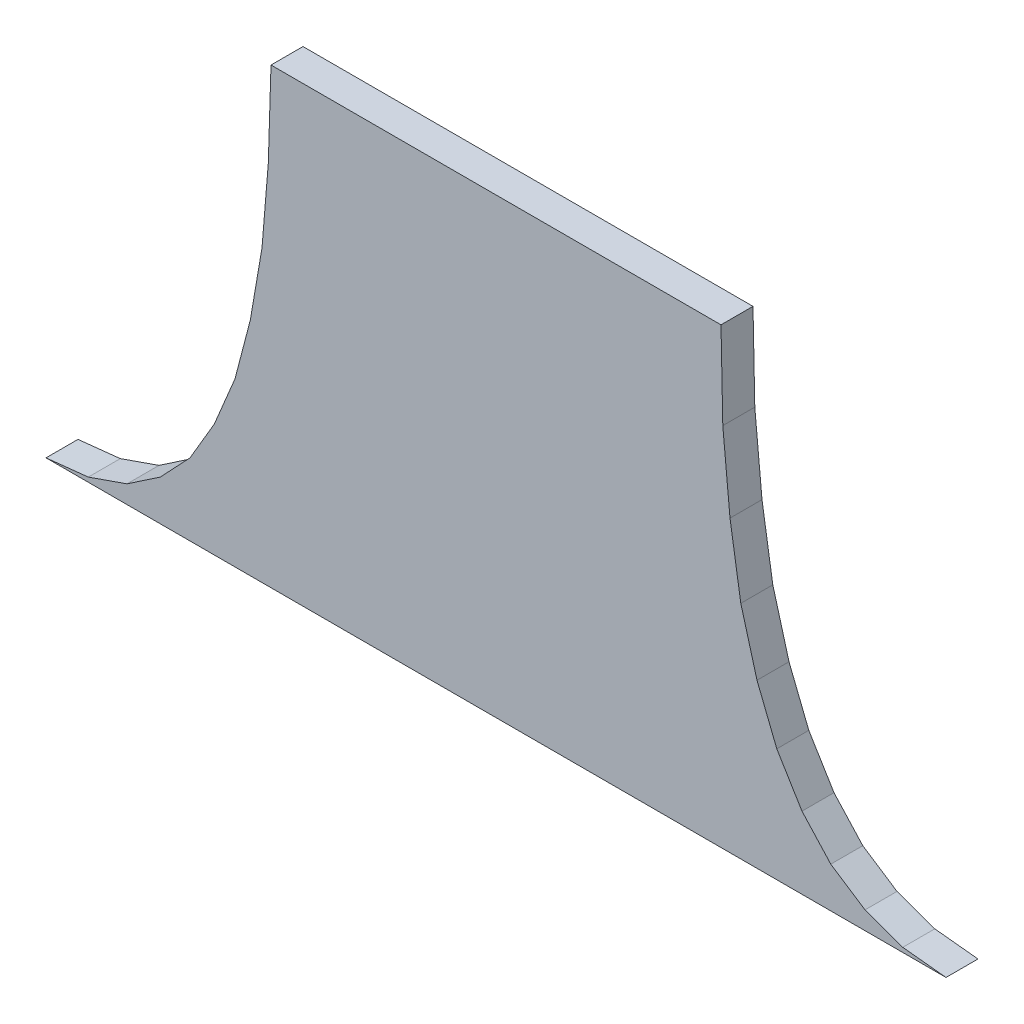
ISO-10303-21;
HEADER;
FILE_DESCRIPTION(('STEP AP214'),'2;1');
FILE_NAME('part.step','',(''),(''),'','','');
FILE_SCHEMA(('AUTOMOTIVE_DESIGN { 1 0 10303 214 1 1 1 1 }'));
ENDSEC;
DATA;
#1=APPLICATION_CONTEXT('core data for automotive mechanical design processes');
#2=APPLICATION_PROTOCOL_DEFINITION('international standard','automotive_design',2000,#1);
#3=PRODUCT_CONTEXT('',#1,'mechanical');
#4=PRODUCT('Part','Part','',(#3));
#5=PRODUCT_RELATED_PRODUCT_CATEGORY('part','',(#4));
#6=PRODUCT_DEFINITION_FORMATION('','',#4);
#7=PRODUCT_DEFINITION_CONTEXT('part definition',#1,'design');
#8=PRODUCT_DEFINITION('design','',#6,#7);
#9=PRODUCT_DEFINITION_SHAPE('','',#8);
#10=(LENGTH_UNIT() NAMED_UNIT(*) SI_UNIT(.MILLI.,.METRE.));
#11=(NAMED_UNIT(*) PLANE_ANGLE_UNIT() SI_UNIT($,.RADIAN.));
#12=(NAMED_UNIT(*) SI_UNIT($,.STERADIAN.) SOLID_ANGLE_UNIT());
#13=UNCERTAINTY_MEASURE_WITH_UNIT(LENGTH_MEASURE(1.E-05),#10,'distance_accuracy_value','');
#14=(GEOMETRIC_REPRESENTATION_CONTEXT(3) GLOBAL_UNCERTAINTY_ASSIGNED_CONTEXT((#13)) GLOBAL_UNIT_ASSIGNED_CONTEXT((#10,
#11,#12)) REPRESENTATION_CONTEXT('',''));
#15=CARTESIAN_POINT('',(0.,0.,0.));
#16=DIRECTION('',(0.,0.,1.));
#17=DIRECTION('',(1.,0.,0.));
#18=AXIS2_PLACEMENT_3D('',#15,#16,#17);
#19=CARTESIAN_POINT('',(32.6500015258789,44.7470016479492,0.));
#20=DIRECTION('',(0.999511378373259,-0.0312570712381688,0.));
#21=DIRECTION('',(-0.0312570712381688,-0.999511378373259,0.));
#22=AXIS2_PLACEMENT_3D('',#19,#20,#21);
#23=PLANE('',#22);
#24=DIRECTION('',(-0.0312570712381688,-0.999511378373259,0.));
#25=VECTOR('',#24,1.);
#26=CARTESIAN_POINT('',(32.6500015258789,44.7470016479492,0.03556));
#27=LINE('',#26,#25);
#28=CARTESIAN_POINT('',(32.6500015258789,44.7470016479492,0.03556));
#29=VERTEX_POINT('',#28);
#30=CARTESIAN_POINT('',(32.6469993591309,44.6510009765625,0.03556));
#31=VERTEX_POINT('',#30);
#32=EDGE_CURVE('E11',#29,#31,#27,.T.);
#33=ORIENTED_EDGE('',*,*,#32,.F.);
#34=DIRECTION('',(0.,0.,1.));
#35=VECTOR('',#34,1.);
#36=CARTESIAN_POINT('',(32.6500015258789,44.7470016479492,0.));
#37=LINE('',#36,#35);
#38=CARTESIAN_POINT('',(32.6500015258789,44.7470016479492,0.));
#39=VERTEX_POINT('',#38);
#40=EDGE_CURVE('E24',#39,#29,#37,.T.);
#41=ORIENTED_EDGE('',*,*,#40,.F.);
#42=DIRECTION('',(-0.0312570712381688,-0.999511378373259,0.));
#43=VECTOR('',#42,1.);
#44=CARTESIAN_POINT('',(32.6500015258789,44.7470016479492,0.));
#45=LINE('',#44,#43);
#46=CARTESIAN_POINT('',(32.6469993591309,44.6510009765625,0.));
#47=VERTEX_POINT('',#46);
#48=EDGE_CURVE('E184',#39,#47,#45,.T.);
#49=ORIENTED_EDGE('',*,*,#48,.T.);
#50=DIRECTION('',(0.,0.,1.));
#51=VECTOR('',#50,1.);
#52=CARTESIAN_POINT('',(32.6469993591309,44.6510009765625,0.));
#53=LINE('',#52,#51);
#54=EDGE_CURVE('E37',#47,#31,#53,.T.);
#55=ORIENTED_EDGE('',*,*,#54,.T.);
#56=EDGE_LOOP('',(#33,#41,#49,#55));
#57=FACE_BOUND('',#56,.T.);
#58=ADVANCED_FACE('F17',(#57),#23,.F.);
#59=CARTESIAN_POINT('',(32.6469993591309,44.6510009765625,0.));
#60=DIRECTION('',(0.996626104946239,-0.0820756172056525,0.));
#61=DIRECTION('',(-0.0820756172056525,-0.996626104946239,0.));
#62=AXIS2_PLACEMENT_3D('',#59,#60,#61);
#63=PLANE('',#62);
#64=DIRECTION('',(-0.0820756172056525,-0.996626104946239,0.));
#65=VECTOR('',#64,1.);
#66=CARTESIAN_POINT('',(32.6469993591309,44.6510009765625,0.03556));
#67=LINE('',#66,#65);
#68=CARTESIAN_POINT('',(32.6399993896484,44.5660018920898,0.03556));
#69=VERTEX_POINT('',#68);
#70=EDGE_CURVE('E336',#31,#69,#67,.T.);
#71=ORIENTED_EDGE('',*,*,#70,.F.);
#72=ORIENTED_EDGE('',*,*,#54,.F.);
#73=DIRECTION('',(-0.0820756172056525,-0.996626104946239,0.));
#74=VECTOR('',#73,1.);
#75=CARTESIAN_POINT('',(32.6469993591309,44.6510009765625,0.));
#76=LINE('',#75,#74);
#77=CARTESIAN_POINT('',(32.6399993896484,44.5660018920898,0.));
#78=VERTEX_POINT('',#77);
#79=EDGE_CURVE('E333',#47,#78,#76,.T.);
#80=ORIENTED_EDGE('',*,*,#79,.T.);
#81=DIRECTION('',(0.,0.,1.));
#82=VECTOR('',#81,1.);
#83=CARTESIAN_POINT('',(32.6399993896484,44.5660018920898,0.));
#84=LINE('',#83,#82);
#85=EDGE_CURVE('E331',#78,#69,#84,.T.);
#86=ORIENTED_EDGE('',*,*,#85,.T.);
#87=EDGE_LOOP('',(#71,#72,#80,#86));
#88=FACE_BOUND('',#87,.T.);
#89=ADVANCED_FACE('F344',(#88),#63,.F.);
#90=CARTESIAN_POINT('',(32.6399993896484,44.5660018920899,0.));
#91=DIRECTION('',(0.985682926044828,-0.16860951723941,0.));
#92=DIRECTION('',(-0.16860951723941,-0.985682926044828,0.));
#93=AXIS2_PLACEMENT_3D('',#90,#91,#92);
#94=PLANE('',#93);
#95=DIRECTION('',(-0.16860951723941,-0.985682926044827,0.));
#96=VECTOR('',#95,1.);
#97=CARTESIAN_POINT('',(32.6399993896484,44.5660018920898,0.03556));
#98=LINE('',#97,#96);
#99=CARTESIAN_POINT('',(32.6269989013672,44.4900016784668,0.03556));
#100=VERTEX_POINT('',#99);
#101=EDGE_CURVE('E328',#69,#100,#98,.T.);
#102=ORIENTED_EDGE('',*,*,#101,.F.);
#103=ORIENTED_EDGE('',*,*,#85,.F.);
#104=DIRECTION('',(-0.16860951723941,-0.985682926044827,0.));
#105=VECTOR('',#104,1.);
#106=CARTESIAN_POINT('',(32.6399993896484,44.5660018920898,0.));
#107=LINE('',#106,#105);
#108=CARTESIAN_POINT('',(32.6269989013672,44.4900016784668,0.));
#109=VERTEX_POINT('',#108);
#110=EDGE_CURVE('E325',#78,#109,#107,.T.);
#111=ORIENTED_EDGE('',*,*,#110,.T.);
#112=DIRECTION('',(0.,0.,1.));
#113=VECTOR('',#112,1.);
#114=CARTESIAN_POINT('',(32.6269989013672,44.4900016784668,0.));
#115=LINE('',#114,#113);
#116=EDGE_CURVE('E323',#109,#100,#115,.T.);
#117=ORIENTED_EDGE('',*,*,#116,.T.);
#118=EDGE_LOOP('',(#102,#103,#111,#117));
#119=FACE_BOUND('',#118,.T.);
#120=ADVANCED_FACE('F350',(#119),#94,.F.);
#121=CARTESIAN_POINT('',(32.6269989013672,44.4900016784668,0.));
#122=DIRECTION('',(0.967467575044013,-0.252995041924655,0.));
#123=DIRECTION('',(-0.252995041924655,-0.967467575044013,0.));
#124=AXIS2_PLACEMENT_3D('',#121,#122,#123);
#125=PLANE('',#124);
#126=DIRECTION('',(-0.252995041924655,-0.967467575044013,0.));
#127=VECTOR('',#126,1.);
#128=CARTESIAN_POINT('',(32.6269989013672,44.4900016784668,0.03556));
#129=LINE('',#128,#127);
#130=CARTESIAN_POINT('',(32.6100006103516,44.4249992370606,0.03556));
#131=VERTEX_POINT('',#130);
#132=EDGE_CURVE('E320',#100,#131,#129,.T.);
#133=ORIENTED_EDGE('',*,*,#132,.F.);
#134=ORIENTED_EDGE('',*,*,#116,.F.);
#135=DIRECTION('',(-0.252995041924655,-0.967467575044013,0.));
#136=VECTOR('',#135,1.);
#137=CARTESIAN_POINT('',(32.6269989013672,44.4900016784668,0.));
#138=LINE('',#137,#136);
#139=CARTESIAN_POINT('',(32.6100006103516,44.4249992370606,0.));
#140=VERTEX_POINT('',#139);
#141=EDGE_CURVE('E317',#109,#140,#138,.T.);
#142=ORIENTED_EDGE('',*,*,#141,.T.);
#143=DIRECTION('',(0.,0.,1.));
#144=VECTOR('',#143,1.);
#145=CARTESIAN_POINT('',(32.6100006103516,44.4249992370606,0.));
#146=LINE('',#145,#144);
#147=EDGE_CURVE('E315',#140,#131,#146,.T.);
#148=ORIENTED_EDGE('',*,*,#147,.T.);
#149=EDGE_LOOP('',(#133,#134,#142,#148));
#150=FACE_BOUND('',#149,.T.);
#151=ADVANCED_FACE('F352',(#150),#125,.F.);
#152=CARTESIAN_POINT('',(32.6100006103516,44.4249992370606,0.));
#153=DIRECTION('',(0.922587744995286,-0.385787315479025,0.));
#154=DIRECTION('',(-0.385787315479025,-0.922587744995286,0.));
#155=AXIS2_PLACEMENT_3D('',#152,#153,#154);
#156=PLANE('',#155);
#157=DIRECTION('',(-0.385787315479025,-0.922587744995286,0.));
#158=VECTOR('',#157,1.);
#159=CARTESIAN_POINT('',(32.6100006103516,44.4249992370606,0.03556));
#160=LINE('',#159,#158);
#161=CARTESIAN_POINT('',(32.5870018005371,44.3699989318848,0.03556));
#162=VERTEX_POINT('',#161);
#163=EDGE_CURVE('E312',#131,#162,#160,.T.);
#164=ORIENTED_EDGE('',*,*,#163,.F.);
#165=ORIENTED_EDGE('',*,*,#147,.F.);
#166=DIRECTION('',(-0.385787315479025,-0.922587744995286,0.));
#167=VECTOR('',#166,1.);
#168=CARTESIAN_POINT('',(32.6100006103516,44.4249992370606,0.));
#169=LINE('',#168,#167);
#170=CARTESIAN_POINT('',(32.5870018005371,44.3699989318848,0.));
#171=VERTEX_POINT('',#170);
#172=EDGE_CURVE('E309',#140,#171,#169,.T.);
#173=ORIENTED_EDGE('',*,*,#172,.T.);
#174=DIRECTION('',(0.,0.,1.));
#175=VECTOR('',#174,1.);
#176=CARTESIAN_POINT('',(32.5870018005371,44.3699989318848,0.));
#177=LINE('',#176,#175);
#178=EDGE_CURVE('E307',#171,#162,#177,.T.);
#179=ORIENTED_EDGE('',*,*,#178,.T.);
#180=EDGE_LOOP('',(#164,#165,#173,#179));
#181=FACE_BOUND('',#180,.T.);
#182=ADVANCED_FACE('F357',(#181),#156,.F.);
#183=CARTESIAN_POINT('',(32.5870018005371,44.3699989318848,0.));
#184=DIRECTION('',(0.862400850754536,-0.506226009424499,0.));
#185=DIRECTION('',(-0.506226009424499,-0.862400850754536,0.));
#186=AXIS2_PLACEMENT_3D('',#183,#184,#185);
#187=PLANE('',#186);
#188=DIRECTION('',(-0.506226009424499,-0.862400850754536,0.));
#189=VECTOR('',#188,1.);
#190=CARTESIAN_POINT('',(32.5870018005371,44.3699989318848,0.03556));
#191=LINE('',#190,#189);
#192=CARTESIAN_POINT('',(32.560001373291,44.3240013122559,0.03556));
#193=VERTEX_POINT('',#192);
#194=EDGE_CURVE('E304',#162,#193,#191,.T.);
#195=ORIENTED_EDGE('',*,*,#194,.F.);
#196=ORIENTED_EDGE('',*,*,#178,.F.);
#197=DIRECTION('',(-0.506226009424499,-0.862400850754536,0.));
#198=VECTOR('',#197,1.);
#199=CARTESIAN_POINT('',(32.5870018005371,44.3699989318848,0.));
#200=LINE('',#199,#198);
#201=CARTESIAN_POINT('',(32.560001373291,44.3240013122559,0.));
#202=VERTEX_POINT('',#201);
#203=EDGE_CURVE('E301',#171,#202,#200,.T.);
#204=ORIENTED_EDGE('',*,*,#203,.T.);
#205=DIRECTION('',(0.,0.,1.));
#206=VECTOR('',#205,1.);
#207=CARTESIAN_POINT('',(32.560001373291,44.3240013122559,0.));
#208=LINE('',#207,#206);
#209=EDGE_CURVE('E299',#202,#193,#208,.T.);
#210=ORIENTED_EDGE('',*,*,#209,.T.);
#211=EDGE_LOOP('',(#195,#196,#204,#210));
#212=FACE_BOUND('',#211,.T.);
#213=ADVANCED_FACE('F360',(#212),#187,.F.);
#214=CARTESIAN_POINT('',(32.560001373291,44.3240013122559,0.));
#215=DIRECTION('',(0.727578097088396,-0.686024862987653,0.));
#216=DIRECTION('',(-0.686024862987653,-0.727578097088396,0.));
#217=AXIS2_PLACEMENT_3D('',#214,#215,#216);
#218=PLANE('',#217);
#219=DIRECTION('',(-0.686024862987653,-0.727578097088396,0.));
#220=VECTOR('',#219,1.);
#221=CARTESIAN_POINT('',(32.560001373291,44.3240013122559,0.03556));
#222=LINE('',#221,#220);
#223=CARTESIAN_POINT('',(32.5270004272461,44.2890014648438,0.03556));
#224=VERTEX_POINT('',#223);
#225=EDGE_CURVE('E296',#193,#224,#222,.T.);
#226=ORIENTED_EDGE('',*,*,#225,.F.);
#227=ORIENTED_EDGE('',*,*,#209,.F.);
#228=DIRECTION('',(-0.686024862987653,-0.727578097088396,0.));
#229=VECTOR('',#228,1.);
#230=CARTESIAN_POINT('',(32.560001373291,44.3240013122559,0.));
#231=LINE('',#230,#229);
#232=CARTESIAN_POINT('',(32.5270004272461,44.2890014648438,0.));
#233=VERTEX_POINT('',#232);
#234=EDGE_CURVE('E293',#202,#233,#231,.T.);
#235=ORIENTED_EDGE('',*,*,#234,.T.);
#236=DIRECTION('',(0.,0.,1.));
#237=VECTOR('',#236,1.);
#238=CARTESIAN_POINT('',(32.5270004272461,44.2890014648438,0.));
#239=LINE('',#238,#237);
#240=EDGE_CURVE('E291',#233,#224,#239,.T.);
#241=ORIENTED_EDGE('',*,*,#240,.T.);
#242=EDGE_LOOP('',(#226,#227,#235,#241));
#243=FACE_BOUND('',#242,.T.);
#244=ADVANCED_FACE('F365',(#243),#218,.F.);
#245=CARTESIAN_POINT('',(32.5270004272461,44.2890014648438,0.));
#246=DIRECTION('',(0.559893869646089,-0.828564333490604,0.));
#247=DIRECTION('',(-0.828564333490604,-0.559893869646089,0.));
#248=AXIS2_PLACEMENT_3D('',#245,#246,#247);
#249=PLANE('',#248);
#250=DIRECTION('',(-0.828564333490604,-0.559893869646089,0.));
#251=VECTOR('',#250,1.);
#252=CARTESIAN_POINT('',(32.5270004272461,44.2890014648438,0.03556));
#253=LINE('',#252,#251);
#254=CARTESIAN_POINT('',(32.4900016784668,44.2639999389648,0.03556));
#255=VERTEX_POINT('',#254);
#256=EDGE_CURVE('E288',#224,#255,#253,.T.);
#257=ORIENTED_EDGE('',*,*,#256,.F.);
#258=ORIENTED_EDGE('',*,*,#240,.F.);
#259=DIRECTION('',(-0.828564333490604,-0.559893869646089,0.));
#260=VECTOR('',#259,1.);
#261=CARTESIAN_POINT('',(32.5270004272461,44.2890014648438,0.));
#262=LINE('',#261,#260);
#263=CARTESIAN_POINT('',(32.4900016784668,44.2639999389648,0.));
#264=VERTEX_POINT('',#263);
#265=EDGE_CURVE('E285',#233,#264,#262,.T.);
#266=ORIENTED_EDGE('',*,*,#265,.T.);
#267=DIRECTION('',(0.,0.,1.));
#268=VECTOR('',#267,1.);
#269=CARTESIAN_POINT('',(32.4900016784668,44.2639999389648,0.));
#270=LINE('',#269,#268);
#271=EDGE_CURVE('E283',#264,#255,#270,.T.);
#272=ORIENTED_EDGE('',*,*,#271,.T.);
#273=EDGE_LOOP('',(#257,#258,#266,#272));
#274=FACE_BOUND('',#273,.T.);
#275=ADVANCED_FACE('F368',(#274),#249,.F.);
#276=CARTESIAN_POINT('',(32.4900016784668,44.2639999389648,0.));
#277=DIRECTION('',(0.329339161494168,-0.944211690621504,0.));
#278=DIRECTION('',(-0.944211690621504,-0.329339161494168,0.));
#279=AXIS2_PLACEMENT_3D('',#276,#277,#278);
#280=PLANE('',#279);
#281=DIRECTION('',(-0.944211690621504,-0.329339161494168,0.));
#282=VECTOR('',#281,1.);
#283=CARTESIAN_POINT('',(32.4900016784668,44.2639999389648,0.03556));
#284=LINE('',#283,#282);
#285=CARTESIAN_POINT('',(32.4469985961914,44.2490005493164,0.03556));
#286=VERTEX_POINT('',#285);
#287=EDGE_CURVE('E280',#255,#286,#284,.T.);
#288=ORIENTED_EDGE('',*,*,#287,.F.);
#289=ORIENTED_EDGE('',*,*,#271,.F.);
#290=DIRECTION('',(-0.944211690621504,-0.329339161494168,0.));
#291=VECTOR('',#290,1.);
#292=CARTESIAN_POINT('',(32.4900016784668,44.2639999389648,0.));
#293=LINE('',#292,#291);
#294=CARTESIAN_POINT('',(32.4469985961914,44.2490005493164,0.));
#295=VERTEX_POINT('',#294);
#296=EDGE_CURVE('E277',#264,#295,#293,.T.);
#297=ORIENTED_EDGE('',*,*,#296,.T.);
#298=DIRECTION('',(0.,0.,1.));
#299=VECTOR('',#298,1.);
#300=CARTESIAN_POINT('',(32.4469985961914,44.2490005493164,0.));
#301=LINE('',#300,#299);
#302=EDGE_CURVE('E275',#295,#286,#301,.T.);
#303=ORIENTED_EDGE('',*,*,#302,.T.);
#304=EDGE_LOOP('',(#288,#289,#297,#303));
#305=FACE_BOUND('',#304,.T.);
#306=ADVANCED_FACE('F373',(#305),#280,.F.);
#307=CARTESIAN_POINT('',(32.4469985961914,44.2490005493164,0.));
#308=DIRECTION('',(0.105814921959899,-0.994385841758932,0.));
#309=DIRECTION('',(-0.994385841758932,-0.105814921959899,0.));
#310=AXIS2_PLACEMENT_3D('',#307,#308,#309);
#311=PLANE('',#310);
#312=DIRECTION('',(-0.994385841758932,-0.105814921959899,0.));
#313=VECTOR('',#312,1.);
#314=CARTESIAN_POINT('',(32.4469985961914,44.2490005493164,0.03556));
#315=LINE('',#314,#313);
#316=CARTESIAN_POINT('',(32.4000015258789,44.2439994812012,0.03556));
#317=VERTEX_POINT('',#316);
#318=EDGE_CURVE('E272',#286,#317,#315,.T.);
#319=ORIENTED_EDGE('',*,*,#318,.F.);
#320=ORIENTED_EDGE('',*,*,#302,.F.);
#321=DIRECTION('',(-0.994385841758932,-0.105814921959899,0.));
#322=VECTOR('',#321,1.);
#323=CARTESIAN_POINT('',(32.4469985961914,44.2490005493164,0.));
#324=LINE('',#323,#322);
#325=CARTESIAN_POINT('',(32.4000015258789,44.2439994812012,0.));
#326=VERTEX_POINT('',#325);
#327=EDGE_CURVE('E269',#295,#326,#324,.T.);
#328=ORIENTED_EDGE('',*,*,#327,.T.);
#329=DIRECTION('',(0.,0.,1.));
#330=VECTOR('',#329,1.);
#331=CARTESIAN_POINT('',(32.4000015258789,44.2439994812012,0.));
#332=LINE('',#331,#330);
#333=EDGE_CURVE('E267',#326,#317,#332,.T.);
#334=ORIENTED_EDGE('',*,*,#333,.T.);
#335=EDGE_LOOP('',(#319,#320,#328,#334));
#336=FACE_BOUND('',#335,.T.);
#337=ADVANCED_FACE('F376',(#336),#311,.F.);
#338=CARTESIAN_POINT('',(32.4000015258789,44.2439994812012,0.));
#339=DIRECTION('',(0.,1.,0.));
#340=DIRECTION('',(1.,0.,0.));
#341=AXIS2_PLACEMENT_3D('',#338,#339,#340);
#342=PLANE('',#341);
#343=DIRECTION('',(1.,0.,0.));
#344=VECTOR('',#343,1.);
#345=CARTESIAN_POINT('',(32.4000015258789,44.2439994812012,0.03556));
#346=LINE('',#345,#344);
#347=CARTESIAN_POINT('',(33.4000015258789,44.2439994812012,0.03556));
#348=VERTEX_POINT('',#347);
#349=EDGE_CURVE('E264',#317,#348,#346,.T.);
#350=ORIENTED_EDGE('',*,*,#349,.F.);
#351=ORIENTED_EDGE('',*,*,#333,.F.);
#352=DIRECTION('',(1.,0.,0.));
#353=VECTOR('',#352,1.);
#354=CARTESIAN_POINT('',(32.4000015258789,44.2439994812012,0.));
#355=LINE('',#354,#353);
#356=CARTESIAN_POINT('',(33.4000015258789,44.2439994812012,0.));
#357=VERTEX_POINT('',#356);
#358=EDGE_CURVE('E261',#326,#357,#355,.T.);
#359=ORIENTED_EDGE('',*,*,#358,.T.);
#360=DIRECTION('',(0.,0.,1.));
#361=VECTOR('',#360,1.);
#362=CARTESIAN_POINT('',(33.4000015258789,44.2439994812012,0.));
#363=LINE('',#362,#361);
#364=EDGE_CURVE('E259',#357,#348,#363,.T.);
#365=ORIENTED_EDGE('',*,*,#364,.T.);
#366=EDGE_LOOP('',(#350,#351,#359,#365));
#367=FACE_BOUND('',#366,.T.);
#368=ADVANCED_FACE('F381',(#367),#342,.F.);
#369=CARTESIAN_POINT('',(33.4000015258789,44.2439994812012,0.));
#370=DIRECTION('',(-0.103627262308644,-0.994616202616072,0.));
#371=DIRECTION('',(-0.994616202616072,0.103627262308644,0.));
#372=AXIS2_PLACEMENT_3D('',#369,#370,#371);
#373=PLANE('',#372);
#374=DIRECTION('',(-0.994616202616072,0.103627262308644,0.));
#375=VECTOR('',#374,1.);
#376=CARTESIAN_POINT('',(33.4000015258789,44.2439994812012,0.03556));
#377=LINE('',#376,#375);
#378=CARTESIAN_POINT('',(33.3520011901855,44.2490005493164,0.03556));
#379=VERTEX_POINT('',#378);
#380=EDGE_CURVE('E256',#348,#379,#377,.T.);
#381=ORIENTED_EDGE('',*,*,#380,.F.);
#382=ORIENTED_EDGE('',*,*,#364,.F.);
#383=DIRECTION('',(-0.994616202616072,0.103627262308644,0.));
#384=VECTOR('',#383,1.);
#385=CARTESIAN_POINT('',(33.4000015258789,44.2439994812012,0.));
#386=LINE('',#385,#384);
#387=CARTESIAN_POINT('',(33.3520011901855,44.2490005493164,0.));
#388=VERTEX_POINT('',#387);
#389=EDGE_CURVE('E253',#357,#388,#386,.T.);
#390=ORIENTED_EDGE('',*,*,#389,.T.);
#391=DIRECTION('',(0.,0.,1.));
#392=VECTOR('',#391,1.);
#393=CARTESIAN_POINT('',(33.3520011901855,44.2490005493164,0.));
#394=LINE('',#393,#392);
#395=EDGE_CURVE('E251',#388,#379,#394,.T.);
#396=ORIENTED_EDGE('',*,*,#395,.T.);
#397=EDGE_LOOP('',(#381,#382,#390,#396));
#398=FACE_BOUND('',#397,.T.);
#399=ADVANCED_FACE('F384',(#398),#373,.F.);
#400=CARTESIAN_POINT('',(33.3520011901855,44.2490005493164,0.));
#401=DIRECTION('',(-0.336325559899805,-0.941745781916799,0.));
#402=DIRECTION('',(-0.941745781916799,0.336325559899805,0.));
#403=AXIS2_PLACEMENT_3D('',#400,#401,#402);
#404=PLANE('',#403);
#405=DIRECTION('',(-0.941745781916799,0.336325559899805,0.));
#406=VECTOR('',#405,1.);
#407=CARTESIAN_POINT('',(33.3520011901855,44.2490005493164,0.03556));
#408=LINE('',#407,#406);
#409=CARTESIAN_POINT('',(33.310001373291,44.2639999389648,0.03556));
#410=VERTEX_POINT('',#409);
#411=EDGE_CURVE('E248',#379,#410,#408,.T.);
#412=ORIENTED_EDGE('',*,*,#411,.F.);
#413=ORIENTED_EDGE('',*,*,#395,.F.);
#414=DIRECTION('',(-0.941745781916799,0.336325559899805,0.));
#415=VECTOR('',#414,1.);
#416=CARTESIAN_POINT('',(33.3520011901855,44.2490005493164,0.));
#417=LINE('',#416,#415);
#418=CARTESIAN_POINT('',(33.310001373291,44.2639999389648,0.));
#419=VERTEX_POINT('',#418);
#420=EDGE_CURVE('E245',#388,#419,#417,.T.);
#421=ORIENTED_EDGE('',*,*,#420,.T.);
#422=DIRECTION('',(0.,0.,1.));
#423=VECTOR('',#422,1.);
#424=CARTESIAN_POINT('',(33.310001373291,44.2639999389648,0.));
#425=LINE('',#424,#423);
#426=EDGE_CURVE('E243',#419,#410,#425,.T.);
#427=ORIENTED_EDGE('',*,*,#426,.T.);
#428=EDGE_LOOP('',(#412,#413,#421,#427));
#429=FACE_BOUND('',#428,.T.);
#430=ADVANCED_FACE('F389',(#429),#404,.F.);
#431=CARTESIAN_POINT('',(33.310001373291,44.2639999389648,0.));
#432=DIRECTION('',(-0.549619581884933,-0.83541505565116,0.));
#433=DIRECTION('',(-0.83541505565116,0.549619581884933,0.));
#434=AXIS2_PLACEMENT_3D('',#431,#432,#433);
#435=PLANE('',#434);
#436=DIRECTION('',(-0.83541505565116,0.549619581884933,0.));
#437=VECTOR('',#436,1.);
#438=CARTESIAN_POINT('',(33.310001373291,44.2639999389648,0.03556));
#439=LINE('',#438,#437);
#440=CARTESIAN_POINT('',(33.2719993591309,44.2890014648438,0.03556));
#441=VERTEX_POINT('',#440);
#442=EDGE_CURVE('E240',#410,#441,#439,.T.);
#443=ORIENTED_EDGE('',*,*,#442,.F.);
#444=ORIENTED_EDGE('',*,*,#426,.F.);
#445=DIRECTION('',(-0.83541505565116,0.549619581884933,0.));
#446=VECTOR('',#445,1.);
#447=CARTESIAN_POINT('',(33.310001373291,44.2639999389648,0.));
#448=LINE('',#447,#446);
#449=CARTESIAN_POINT('',(33.2719993591309,44.2890014648438,0.));
#450=VERTEX_POINT('',#449);
#451=EDGE_CURVE('E237',#419,#450,#448,.T.);
#452=ORIENTED_EDGE('',*,*,#451,.T.);
#453=DIRECTION('',(0.,0.,1.));
#454=VECTOR('',#453,1.);
#455=CARTESIAN_POINT('',(33.2719993591309,44.2890014648438,0.));
#456=LINE('',#455,#454);
#457=EDGE_CURVE('E235',#450,#441,#456,.T.);
#458=ORIENTED_EDGE('',*,*,#457,.T.);
#459=EDGE_LOOP('',(#443,#444,#452,#458));
#460=FACE_BOUND('',#459,.T.);
#461=ADVANCED_FACE('F392',(#460),#435,.F.);
#462=CARTESIAN_POINT('',(33.2719993591309,44.2890014648438,0.));
#463=DIRECTION('',(-0.738051702918442,-0.674744161752577,0.));
#464=DIRECTION('',(-0.674744161752577,0.738051702918442,0.));
#465=AXIS2_PLACEMENT_3D('',#462,#463,#464);
#466=PLANE('',#465);
#467=DIRECTION('',(-0.674744161752577,0.738051702918442,0.));
#468=VECTOR('',#467,1.);
#469=CARTESIAN_POINT('',(33.2719993591309,44.2890014648438,0.03556));
#470=LINE('',#469,#468);
#471=CARTESIAN_POINT('',(33.2400016784668,44.3240013122559,0.03556));
#472=VERTEX_POINT('',#471);
#473=EDGE_CURVE('E232',#441,#472,#470,.T.);
#474=ORIENTED_EDGE('',*,*,#473,.F.);
#475=ORIENTED_EDGE('',*,*,#457,.F.);
#476=DIRECTION('',(-0.674744161752577,0.738051702918442,0.));
#477=VECTOR('',#476,1.);
#478=CARTESIAN_POINT('',(33.2719993591309,44.2890014648438,0.));
#479=LINE('',#478,#477);
#480=CARTESIAN_POINT('',(33.2400016784668,44.3240013122559,0.));
#481=VERTEX_POINT('',#480);
#482=EDGE_CURVE('E229',#450,#481,#479,.T.);
#483=ORIENTED_EDGE('',*,*,#482,.T.);
#484=DIRECTION('',(0.,0.,1.));
#485=VECTOR('',#484,1.);
#486=CARTESIAN_POINT('',(33.2400016784668,44.3240013122559,0.));
#487=LINE('',#486,#485);
#488=EDGE_CURVE('E227',#481,#472,#487,.T.);
#489=ORIENTED_EDGE('',*,*,#488,.T.);
#490=EDGE_LOOP('',(#474,#475,#483,#489));
#491=FACE_BOUND('',#490,.T.);
#492=ADVANCED_FACE('F397',(#491),#466,.F.);
#493=CARTESIAN_POINT('',(33.2400016784668,44.3240013122559,0.));
#494=DIRECTION('',(-0.854187611880812,-0.519964925460703,0.));
#495=DIRECTION('',(-0.519964925460703,0.854187611880812,0.));
#496=AXIS2_PLACEMENT_3D('',#493,#494,#495);
#497=PLANE('',#496);
#498=DIRECTION('',(-0.519964925460703,0.854187611880812,0.));
#499=VECTOR('',#498,1.);
#500=CARTESIAN_POINT('',(33.2400016784668,44.3240013122559,0.03556));
#501=LINE('',#500,#499);
#502=CARTESIAN_POINT('',(33.2120018005371,44.3699989318848,0.03556));
#503=VERTEX_POINT('',#502);
#504=EDGE_CURVE('E224',#472,#503,#501,.T.);
#505=ORIENTED_EDGE('',*,*,#504,.F.);
#506=ORIENTED_EDGE('',*,*,#488,.F.);
#507=DIRECTION('',(-0.519964925460703,0.854187611880812,0.));
#508=VECTOR('',#507,1.);
#509=CARTESIAN_POINT('',(33.2400016784668,44.3240013122559,0.));
#510=LINE('',#509,#508);
#511=CARTESIAN_POINT('',(33.2120018005371,44.3699989318848,0.));
#512=VERTEX_POINT('',#511);
#513=EDGE_CURVE('E221',#481,#512,#510,.T.);
#514=ORIENTED_EDGE('',*,*,#513,.T.);
#515=DIRECTION('',(0.,0.,1.));
#516=VECTOR('',#515,1.);
#517=CARTESIAN_POINT('',(33.2120018005371,44.3699989318848,0.));
#518=LINE('',#517,#516);
#519=EDGE_CURVE('E219',#512,#503,#518,.T.);
#520=ORIENTED_EDGE('',*,*,#519,.T.);
#521=EDGE_LOOP('',(#505,#506,#514,#520));
#522=FACE_BOUND('',#521,.T.);
#523=ADVANCED_FACE('F400',(#522),#497,.F.);
#524=CARTESIAN_POINT('',(33.2120018005371,44.3699989318848,0.));
#525=DIRECTION('',(-0.92845892545913,-0.371435086839247,0.));
#526=DIRECTION('',(-0.371435086839247,0.92845892545913,0.));
#527=AXIS2_PLACEMENT_3D('',#524,#525,#526);
#528=PLANE('',#527);
#529=DIRECTION('',(-0.371435086839247,0.92845892545913,0.));
#530=VECTOR('',#529,1.);
#531=CARTESIAN_POINT('',(33.2120018005371,44.3699989318848,0.03556));
#532=LINE('',#531,#530);
#533=CARTESIAN_POINT('',(33.189998626709,44.4249992370606,0.03556));
#534=VERTEX_POINT('',#533);
#535=EDGE_CURVE('E216',#503,#534,#532,.T.);
#536=ORIENTED_EDGE('',*,*,#535,.F.);
#537=ORIENTED_EDGE('',*,*,#519,.F.);
#538=DIRECTION('',(-0.371435086839247,0.92845892545913,0.));
#539=VECTOR('',#538,1.);
#540=CARTESIAN_POINT('',(33.2120018005371,44.3699989318848,0.));
#541=LINE('',#540,#539);
#542=CARTESIAN_POINT('',(33.189998626709,44.4249992370606,0.));
#543=VERTEX_POINT('',#542);
#544=EDGE_CURVE('E213',#512,#543,#541,.T.);
#545=ORIENTED_EDGE('',*,*,#544,.T.);
#546=DIRECTION('',(0.,0.,1.));
#547=VECTOR('',#546,1.);
#548=CARTESIAN_POINT('',(33.189998626709,44.4249992370606,0.));
#549=LINE('',#548,#547);
#550=EDGE_CURVE('E211',#543,#534,#549,.T.);
#551=ORIENTED_EDGE('',*,*,#550,.T.);
#552=EDGE_LOOP('',(#536,#537,#545,#551));
#553=FACE_BOUND('',#552,.T.);
#554=ADVANCED_FACE('F405',(#553),#528,.F.);
#555=CARTESIAN_POINT('',(33.189998626709,44.4249992370606,0.));
#556=DIRECTION('',(-0.963741210703356,-0.266838675592631,0.));
#557=DIRECTION('',(-0.266838675592631,0.963741210703356,0.));
#558=AXIS2_PLACEMENT_3D('',#555,#556,#557);
#559=PLANE('',#558);
#560=DIRECTION('',(-0.266838675592631,0.963741210703356,0.));
#561=VECTOR('',#560,1.);
#562=CARTESIAN_POINT('',(33.189998626709,44.4249992370606,0.03556));
#563=LINE('',#562,#561);
#564=CARTESIAN_POINT('',(33.1720008850098,44.4900016784668,0.03556));
#565=VERTEX_POINT('',#564);
#566=EDGE_CURVE('E208',#534,#565,#563,.T.);
#567=ORIENTED_EDGE('',*,*,#566,.F.);
#568=ORIENTED_EDGE('',*,*,#550,.F.);
#569=DIRECTION('',(-0.266838675592631,0.963741210703356,0.));
#570=VECTOR('',#569,1.);
#571=CARTESIAN_POINT('',(33.189998626709,44.4249992370606,0.));
#572=LINE('',#571,#570);
#573=CARTESIAN_POINT('',(33.1720008850098,44.4900016784668,0.));
#574=VERTEX_POINT('',#573);
#575=EDGE_CURVE('E205',#543,#574,#572,.T.);
#576=ORIENTED_EDGE('',*,*,#575,.T.);
#577=DIRECTION('',(0.,0.,1.));
#578=VECTOR('',#577,1.);
#579=CARTESIAN_POINT('',(33.1720008850098,44.4900016784668,0.));
#580=LINE('',#579,#578);
#581=EDGE_CURVE('E203',#574,#565,#580,.T.);
#582=ORIENTED_EDGE('',*,*,#581,.T.);
#583=EDGE_LOOP('',(#567,#568,#576,#582));
#584=FACE_BOUND('',#583,.T.);
#585=ADVANCED_FACE('F408',(#584),#559,.F.);
#586=CARTESIAN_POINT('',(33.1720008850098,44.4900016784668,0.));
#587=DIRECTION('',(-0.987760955290557,-0.155975303184465,0.));
#588=DIRECTION('',(-0.155975303184465,0.987760955290557,0.));
#589=AXIS2_PLACEMENT_3D('',#586,#587,#588);
#590=PLANE('',#589);
#591=DIRECTION('',(-0.155975303184465,0.987760955290557,0.));
#592=VECTOR('',#591,1.);
#593=CARTESIAN_POINT('',(33.1720008850098,44.4900016784668,0.03556));
#594=LINE('',#593,#592);
#595=CARTESIAN_POINT('',(33.1599998474121,44.5660018920898,0.03556));
#596=VERTEX_POINT('',#595);
#597=EDGE_CURVE('E200',#565,#596,#594,.T.);
#598=ORIENTED_EDGE('',*,*,#597,.F.);
#599=ORIENTED_EDGE('',*,*,#581,.F.);
#600=DIRECTION('',(-0.155975303184465,0.987760955290557,0.));
#601=VECTOR('',#600,1.);
#602=CARTESIAN_POINT('',(33.1720008850098,44.4900016784668,0.));
#603=LINE('',#602,#601);
#604=CARTESIAN_POINT('',(33.1599998474121,44.5660018920898,0.));
#605=VERTEX_POINT('',#604);
#606=EDGE_CURVE('E197',#574,#605,#603,.T.);
#607=ORIENTED_EDGE('',*,*,#606,.T.);
#608=DIRECTION('',(0.,0.,1.));
#609=VECTOR('',#608,1.);
#610=CARTESIAN_POINT('',(33.1599998474121,44.5660018920898,0.));
#611=LINE('',#610,#609);
#612=EDGE_CURVE('E195',#605,#596,#611,.T.);
#613=ORIENTED_EDGE('',*,*,#612,.T.);
#614=EDGE_LOOP('',(#598,#599,#607,#613));
#615=FACE_BOUND('',#614,.T.);
#616=ADVANCED_FACE('F413',(#615),#590,.F.);
#617=CARTESIAN_POINT('',(33.1599998474121,44.5660018920899,0.));
#618=DIRECTION('',(-0.995600683079774,-0.0936978113463013,0.));
#619=DIRECTION('',(-0.0936978113463013,0.995600683079774,0.));
#620=AXIS2_PLACEMENT_3D('',#617,#618,#619);
#621=PLANE('',#620);
#622=DIRECTION('',(-0.0936978113463013,0.995600683079774,0.));
#623=VECTOR('',#622,1.);
#624=CARTESIAN_POINT('',(33.1599998474121,44.5660018920898,0.03556));
#625=LINE('',#624,#623);
#626=CARTESIAN_POINT('',(33.1520004272461,44.6510009765625,0.03556));
#627=VERTEX_POINT('',#626);
#628=EDGE_CURVE('E192',#596,#627,#625,.T.);
#629=ORIENTED_EDGE('',*,*,#628,.F.);
#630=ORIENTED_EDGE('',*,*,#612,.F.);
#631=DIRECTION('',(-0.0936978113463013,0.995600683079774,0.));
#632=VECTOR('',#631,1.);
#633=CARTESIAN_POINT('',(33.1599998474121,44.5660018920898,0.));
#634=LINE('',#633,#632);
#635=CARTESIAN_POINT('',(33.1520004272461,44.6510009765625,0.));
#636=VERTEX_POINT('',#635);
#637=EDGE_CURVE('E190',#605,#636,#634,.T.);
#638=ORIENTED_EDGE('',*,*,#637,.T.);
#639=DIRECTION('',(0.,0.,1.));
#640=VECTOR('',#639,1.);
#641=CARTESIAN_POINT('',(33.1520004272461,44.6510009765625,0.));
#642=LINE('',#641,#640);
#643=EDGE_CURVE('E175',#636,#627,#642,.T.);
#644=ORIENTED_EDGE('',*,*,#643,.T.);
#645=EDGE_LOOP('',(#629,#630,#638,#644));
#646=FACE_BOUND('',#645,.T.);
#647=ADVANCED_FACE('F415',(#646),#621,.F.);
#648=CARTESIAN_POINT('',(33.1520004272461,44.6510009765625,0.));
#649=DIRECTION('',(-0.999783297956284,-0.0208172315079509,0.));
#650=DIRECTION('',(-0.0208172315079509,0.999783297956284,0.));
#651=AXIS2_PLACEMENT_3D('',#648,#649,#650);
#652=PLANE('',#651);
#653=DIRECTION('',(-0.0208172315079509,0.999783297956284,0.));
#654=VECTOR('',#653,1.);
#655=CARTESIAN_POINT('',(33.1520004272461,44.6510009765625,0.03556));
#656=LINE('',#655,#654);
#657=CARTESIAN_POINT('',(33.1500015258789,44.7470016479492,0.03556));
#658=VERTEX_POINT('',#657);
#659=EDGE_CURVE('E179',#627,#658,#656,.T.);
#660=ORIENTED_EDGE('',*,*,#659,.F.);
#661=ORIENTED_EDGE('',*,*,#643,.F.);
#662=DIRECTION('',(-0.0208172315079509,0.999783297956284,0.));
#663=VECTOR('',#662,1.);
#664=CARTESIAN_POINT('',(33.1520004272461,44.6510009765625,0.));
#665=LINE('',#664,#663);
#666=CARTESIAN_POINT('',(33.1500015258789,44.7470016479492,0.));
#667=VERTEX_POINT('',#666);
#668=EDGE_CURVE('E171',#636,#667,#665,.T.);
#669=ORIENTED_EDGE('',*,*,#668,.T.);
#670=DIRECTION('',(0.,0.,1.));
#671=VECTOR('',#670,1.);
#672=CARTESIAN_POINT('',(33.1500015258789,44.7470016479492,0.));
#673=LINE('',#672,#671);
#674=EDGE_CURVE('E161',#667,#658,#673,.T.);
#675=ORIENTED_EDGE('',*,*,#674,.T.);
#676=EDGE_LOOP('',(#660,#661,#669,#675));
#677=FACE_BOUND('',#676,.T.);
#678=ADVANCED_FACE('F174',(#677),#652,.F.);
#679=CARTESIAN_POINT('',(33.1500015258789,44.7470016479492,0.));
#680=DIRECTION('',(0.,-1.,0.));
#681=DIRECTION('',(-1.,0.,0.));
#682=AXIS2_PLACEMENT_3D('',#679,#680,#681);
#683=PLANE('',#682);
#684=DIRECTION('',(-1.,0.,0.));
#685=VECTOR('',#684,1.);
#686=CARTESIAN_POINT('',(33.1500015258789,44.7470016479492,0.03556));
#687=LINE('',#686,#685);
#688=EDGE_CURVE('E167',#658,#29,#687,.T.);
#689=ORIENTED_EDGE('',*,*,#688,.F.);
#690=ORIENTED_EDGE('',*,*,#674,.F.);
#691=DIRECTION('',(-1.,0.,0.));
#692=VECTOR('',#691,1.);
#693=CARTESIAN_POINT('',(33.1500015258789,44.7470016479492,0.));
#694=LINE('',#693,#692);
#695=EDGE_CURVE('E165',#667,#39,#694,.T.);
#696=ORIENTED_EDGE('',*,*,#695,.T.);
#697=ORIENTED_EDGE('',*,*,#40,.T.);
#698=EDGE_LOOP('',(#689,#690,#696,#697));
#699=FACE_BOUND('',#698,.T.);
#700=ADVANCED_FACE('F163',(#699),#683,.F.);
#701=CARTESIAN_POINT('',(32.6500015258789,44.7470016479492,0.));
#702=DIRECTION('',(0.,0.,1.));
#703=DIRECTION('',(1.,0.,0.));
#704=AXIS2_PLACEMENT_3D('',#701,#702,#703);
#705=PLANE('',#704);
#706=ORIENTED_EDGE('',*,*,#695,.F.);
#707=ORIENTED_EDGE('',*,*,#668,.F.);
#708=ORIENTED_EDGE('',*,*,#637,.F.);
#709=ORIENTED_EDGE('',*,*,#606,.F.);
#710=ORIENTED_EDGE('',*,*,#575,.F.);
#711=ORIENTED_EDGE('',*,*,#544,.F.);
#712=ORIENTED_EDGE('',*,*,#513,.F.);
#713=ORIENTED_EDGE('',*,*,#482,.F.);
#714=ORIENTED_EDGE('',*,*,#451,.F.);
#715=ORIENTED_EDGE('',*,*,#420,.F.);
#716=ORIENTED_EDGE('',*,*,#389,.F.);
#717=ORIENTED_EDGE('',*,*,#358,.F.);
#718=ORIENTED_EDGE('',*,*,#327,.F.);
#719=ORIENTED_EDGE('',*,*,#296,.F.);
#720=ORIENTED_EDGE('',*,*,#265,.F.);
#721=ORIENTED_EDGE('',*,*,#234,.F.);
#722=ORIENTED_EDGE('',*,*,#203,.F.);
#723=ORIENTED_EDGE('',*,*,#172,.F.);
#724=ORIENTED_EDGE('',*,*,#141,.F.);
#725=ORIENTED_EDGE('',*,*,#110,.F.);
#726=ORIENTED_EDGE('',*,*,#79,.F.);
#727=ORIENTED_EDGE('',*,*,#48,.F.);
#728=EDGE_LOOP('',(#706,#707,#708,#709,#710,#711,#712,#713,#714,#715,#716,#717,#718,#719,#720,
#721,#722,#723,#724,#725,#726,#727));
#729=FACE_BOUND('',#728,.T.);
#730=ADVANCED_FACE('F182',(#729),#705,.F.);
#731=CARTESIAN_POINT('',(32.6500015258789,44.7470016479492,0.03556));
#732=DIRECTION('',(0.,0.,1.));
#733=DIRECTION('',(1.,0.,0.));
#734=AXIS2_PLACEMENT_3D('',#731,#732,#733);
#735=PLANE('',#734);
#736=ORIENTED_EDGE('',*,*,#32,.T.);
#737=ORIENTED_EDGE('',*,*,#70,.T.);
#738=ORIENTED_EDGE('',*,*,#101,.T.);
#739=ORIENTED_EDGE('',*,*,#132,.T.);
#740=ORIENTED_EDGE('',*,*,#163,.T.);
#741=ORIENTED_EDGE('',*,*,#194,.T.);
#742=ORIENTED_EDGE('',*,*,#225,.T.);
#743=ORIENTED_EDGE('',*,*,#256,.T.);
#744=ORIENTED_EDGE('',*,*,#287,.T.);
#745=ORIENTED_EDGE('',*,*,#318,.T.);
#746=ORIENTED_EDGE('',*,*,#349,.T.);
#747=ORIENTED_EDGE('',*,*,#380,.T.);
#748=ORIENTED_EDGE('',*,*,#411,.T.);
#749=ORIENTED_EDGE('',*,*,#442,.T.);
#750=ORIENTED_EDGE('',*,*,#473,.T.);
#751=ORIENTED_EDGE('',*,*,#504,.T.);
#752=ORIENTED_EDGE('',*,*,#535,.T.);
#753=ORIENTED_EDGE('',*,*,#566,.T.);
#754=ORIENTED_EDGE('',*,*,#597,.T.);
#755=ORIENTED_EDGE('',*,*,#628,.T.);
#756=ORIENTED_EDGE('',*,*,#659,.T.);
#757=ORIENTED_EDGE('',*,*,#688,.T.);
#758=EDGE_LOOP('',(#736,#737,#738,#739,#740,#741,#742,#743,#744,#745,#746,#747,#748,#749,#750,
#751,#752,#753,#754,#755,#756,#757));
#759=FACE_BOUND('',#758,.T.);
#760=ADVANCED_FACE('F347',(#759),#735,.T.);
#761=CLOSED_SHELL('',(#58,#89,#120,#151,#182,#213,#244,#275,#306,#337,#368,#399,#430,#461,#492,
#523,#554,#585,#616,#647,#678,#700,#730,#760));
#762=MANIFOLD_SOLID_BREP('B1',#761);
#763=ADVANCED_BREP_SHAPE_REPRESENTATION('',(#18,#762),#14);
#764=SHAPE_DEFINITION_REPRESENTATION(#9,#763);
ENDSEC;
END-ISO-10303-21;
